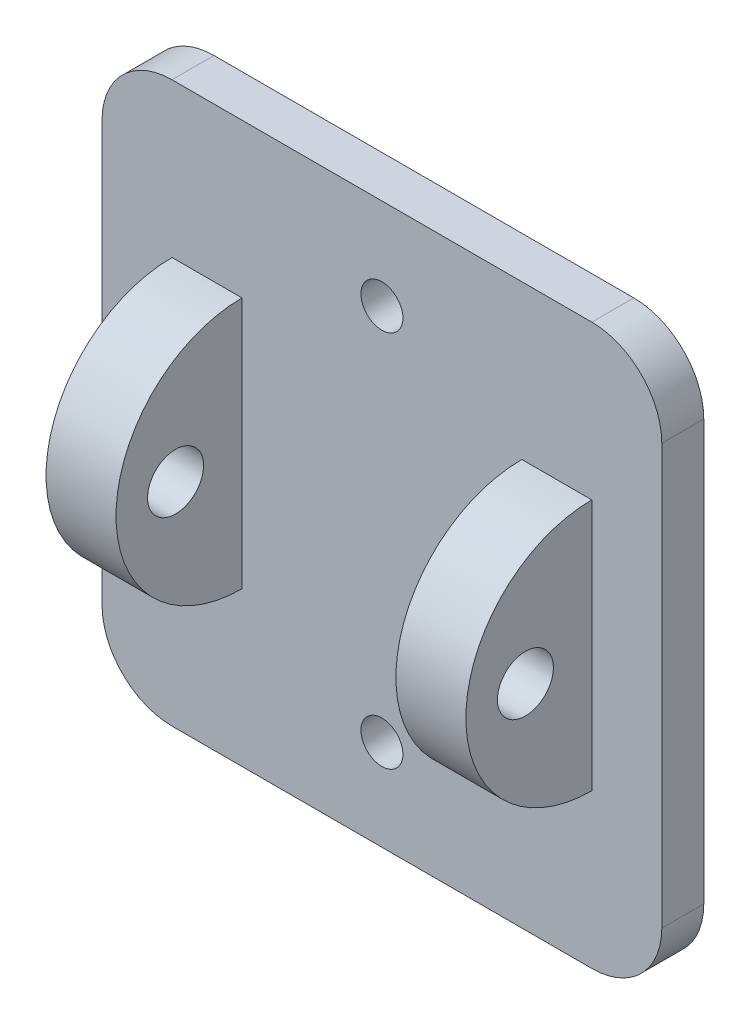
ISO-10303-21;
HEADER;
FILE_DESCRIPTION(('STEP AP214'),'2;1');
FILE_NAME('part.step','',(''),(''),'','','');
FILE_SCHEMA(('AUTOMOTIVE_DESIGN { 1 0 10303 214 1 1 1 1 }'));
ENDSEC;
DATA;
#1=APPLICATION_CONTEXT('core data for automotive mechanical design processes');
#2=APPLICATION_PROTOCOL_DEFINITION('international standard','automotive_design',2000,#1);
#3=PRODUCT_CONTEXT('',#1,'mechanical');
#4=PRODUCT('Part','Part','',(#3));
#5=PRODUCT_RELATED_PRODUCT_CATEGORY('part','',(#4));
#6=PRODUCT_DEFINITION_FORMATION('','',#4);
#7=PRODUCT_DEFINITION_CONTEXT('part definition',#1,'design');
#8=PRODUCT_DEFINITION('design','',#6,#7);
#9=PRODUCT_DEFINITION_SHAPE('','',#8);
#10=(LENGTH_UNIT() NAMED_UNIT(*) SI_UNIT(.MILLI.,.METRE.));
#11=(NAMED_UNIT(*) PLANE_ANGLE_UNIT() SI_UNIT($,.RADIAN.));
#12=(NAMED_UNIT(*) SI_UNIT($,.STERADIAN.) SOLID_ANGLE_UNIT());
#13=UNCERTAINTY_MEASURE_WITH_UNIT(LENGTH_MEASURE(1.E-05),#10,'distance_accuracy_value','');
#14=(GEOMETRIC_REPRESENTATION_CONTEXT(3) GLOBAL_UNCERTAINTY_ASSIGNED_CONTEXT((#13)) GLOBAL_UNIT_ASSIGNED_CONTEXT((#10,
#11,#12)) REPRESENTATION_CONTEXT('',''));
#15=CARTESIAN_POINT('',(0.,0.,0.));
#16=DIRECTION('',(0.,0.,1.));
#17=DIRECTION('',(1.,0.,0.));
#18=AXIS2_PLACEMENT_3D('',#15,#16,#17);
#19=CARTESIAN_POINT('',(22.3123663302852,-6.20192307692307,3.));
#20=DIRECTION('',(-1.,0.,0.));
#21=DIRECTION('',(0.,-1.,0.));
#22=AXIS2_PLACEMENT_3D('',#19,#20,#21);
#23=CYLINDRICAL_SURFACE('',#22,9.);
#24=DIRECTION('',(-1.,0.,0.));
#25=VECTOR('',#24,1.);
#26=CARTESIAN_POINT('',(-7.68763366971484,-15.2019230769231,3.));
#27=LINE('',#26,#25);
#28=CARTESIAN_POINT('',(22.3123663302852,-15.2019230769231,3.));
#29=VERTEX_POINT('',#28);
#30=CARTESIAN_POINT('',(17.3123663302852,-15.2019230769231,3.));
#31=VERTEX_POINT('',#30);
#32=EDGE_CURVE('E136',#29,#31,#27,.T.);
#33=ORIENTED_EDGE('',*,*,#32,.F.);
#34=CARTESIAN_POINT('',(22.3123663302852,-6.20192307692307,3.));
#35=DIRECTION('',(1.,0.,0.));
#36=DIRECTION('',(0.,0.,-1.));
#37=AXIS2_PLACEMENT_3D('',#34,#35,#36);
#38=CIRCLE('',#37,9.);
#39=CARTESIAN_POINT('',(22.3123663302852,2.79807692307693,3.));
#40=VERTEX_POINT('',#39);
#41=EDGE_CURVE('E50',#40,#29,#38,.T.);
#42=ORIENTED_EDGE('',*,*,#41,.F.);
#43=DIRECTION('',(1.,0.,0.));
#44=VECTOR('',#43,1.);
#45=CARTESIAN_POINT('',(-7.68763366971484,2.79807692307693,3.));
#46=LINE('',#45,#44);
#47=CARTESIAN_POINT('',(17.3123663302852,2.79807692307693,3.));
#48=VERTEX_POINT('',#47);
#49=EDGE_CURVE('E135',#48,#40,#46,.T.);
#50=ORIENTED_EDGE('',*,*,#49,.F.);
#51=CARTESIAN_POINT('',(17.3123663302852,-6.20192307692307,3.));
#52=DIRECTION('',(-1.,0.,0.));
#53=DIRECTION('',(0.,0.,1.));
#54=AXIS2_PLACEMENT_3D('',#51,#52,#53);
#55=CIRCLE('',#54,9.);
#56=EDGE_CURVE('E11',#31,#48,#55,.T.);
#57=ORIENTED_EDGE('',*,*,#56,.F.);
#58=EDGE_LOOP('',(#33,#42,#50,#57));
#59=FACE_BOUND('',#58,.T.);
#60=ADVANCED_FACE('F41',(#59),#23,.T.);
#61=CARTESIAN_POINT('',(-2.68763366971484,-6.20192307692307,3.));
#62=DIRECTION('',(-1.,0.,0.));
#63=DIRECTION('',(0.,0.,1.));
#64=AXIS2_PLACEMENT_3D('',#61,#62,#63);
#65=CYLINDRICAL_SURFACE('',#64,9.);
#66=DIRECTION('',(-1.,0.,0.));
#67=VECTOR('',#66,1.);
#68=CARTESIAN_POINT('',(-7.68763366971484,-15.2019230769231,3.));
#69=LINE('',#68,#67);
#70=CARTESIAN_POINT('',(-2.68763366971484,-15.2019230769231,3.));
#71=VERTEX_POINT('',#70);
#72=CARTESIAN_POINT('',(-7.68763366971484,-15.2019230769231,3.));
#73=VERTEX_POINT('',#72);
#74=EDGE_CURVE('E153',#71,#73,#69,.T.);
#75=ORIENTED_EDGE('',*,*,#74,.F.);
#76=CARTESIAN_POINT('',(-2.68763366971484,-6.20192307692307,3.));
#77=DIRECTION('',(1.,0.,0.));
#78=DIRECTION('',(0.,1.,0.));
#79=AXIS2_PLACEMENT_3D('',#76,#77,#78);
#80=CIRCLE('',#79,9.);
#81=CARTESIAN_POINT('',(-2.68763366971484,2.79807692307693,3.));
#82=VERTEX_POINT('',#81);
#83=EDGE_CURVE('E263',#82,#71,#80,.T.);
#84=ORIENTED_EDGE('',*,*,#83,.F.);
#85=DIRECTION('',(1.,0.,0.));
#86=VECTOR('',#85,1.);
#87=CARTESIAN_POINT('',(-7.68763366971484,2.79807692307693,3.));
#88=LINE('',#87,#86);
#89=CARTESIAN_POINT('',(-7.68763366971484,2.79807692307693,3.));
#90=VERTEX_POINT('',#89);
#91=EDGE_CURVE('E161',#90,#82,#88,.T.);
#92=ORIENTED_EDGE('',*,*,#91,.F.);
#93=CARTESIAN_POINT('',(-7.68763366971484,-6.20192307692307,3.));
#94=DIRECTION('',(-1.,0.,0.));
#95=DIRECTION('',(0.,-1.,0.));
#96=AXIS2_PLACEMENT_3D('',#93,#94,#95);
#97=CIRCLE('',#96,9.);
#98=EDGE_CURVE('E266',#73,#90,#97,.T.);
#99=ORIENTED_EDGE('',*,*,#98,.F.);
#100=EDGE_LOOP('',(#75,#84,#92,#99));
#101=FACE_BOUND('',#100,.T.);
#102=ADVANCED_FACE('F275',(#101),#65,.T.);
#103=CARTESIAN_POINT('',(-7.68763366971484,-21.2019230769231,3.));
#104=DIRECTION('',(0.,0.,1.));
#105=DIRECTION('',(1.,0.,0.));
#106=AXIS2_PLACEMENT_3D('',#103,#104,#105);
#107=PLANE('',#106);
#108=DIRECTION('',(0.,1.,0.));
#109=VECTOR('',#108,1.);
#110=CARTESIAN_POINT('',(17.3123663302852,-21.2019230769231,3.));
#111=LINE('',#110,#109);
#112=EDGE_CURVE('E130',#31,#48,#111,.T.);
#113=ORIENTED_EDGE('',*,*,#112,.T.);
#114=ORIENTED_EDGE('',*,*,#49,.T.);
#115=DIRECTION('',(0.,-1.,0.));
#116=VECTOR('',#115,1.);
#117=CARTESIAN_POINT('',(22.3123663302852,-21.2019230769231,3.));
#118=LINE('',#117,#116);
#119=EDGE_CURVE('E141',#40,#29,#118,.T.);
#120=ORIENTED_EDGE('',*,*,#119,.T.);
#121=ORIENTED_EDGE('',*,*,#32,.T.);
#122=EDGE_LOOP('',(#113,#114,#120,#121));
#123=FACE_BOUND('',#122,.T.);
#124=CARTESIAN_POINT('',(7.31236633028516,7.29807692307693,3.));
#125=DIRECTION('',(0.,0.,1.));
#126=DIRECTION('',(1.,0.,0.));
#127=AXIS2_PLACEMENT_3D('',#124,#125,#126);
#128=CIRCLE('',#127,1.5);
#129=CARTESIAN_POINT('',(8.81236633028516,7.29807692307693,3.));
#130=VERTEX_POINT('',#129);
#131=EDGE_CURVE('E174',#130,#130,#128,.T.);
#132=ORIENTED_EDGE('',*,*,#131,.F.);
#133=EDGE_LOOP('',(#132));
#134=FACE_BOUND('',#133,.T.);
#135=CARTESIAN_POINT('',(-7.68763366971484,-21.2019230769231,3.));
#136=DIRECTION('',(0.,0.,1.));
#137=DIRECTION('',(1.,0.,0.));
#138=AXIS2_PLACEMENT_3D('',#135,#136,#137);
#139=CIRCLE('',#138,5.);
#140=CARTESIAN_POINT('',(-12.6876336697148,-21.2019230769231,3.));
#141=VERTEX_POINT('',#140);
#142=CARTESIAN_POINT('',(-7.68763366971484,-26.2019230769231,3.));
#143=VERTEX_POINT('',#142);
#144=EDGE_CURVE('E182',#141,#143,#139,.T.);
#145=ORIENTED_EDGE('',*,*,#144,.T.);
#146=DIRECTION('',(1.,0.,0.));
#147=VECTOR('',#146,1.);
#148=CARTESIAN_POINT('',(-7.68763366971484,-26.2019230769231,3.));
#149=LINE('',#148,#147);
#150=CARTESIAN_POINT('',(22.3123663302852,-26.2019230769231,3.));
#151=VERTEX_POINT('',#150);
#152=EDGE_CURVE('E186',#143,#151,#149,.T.);
#153=ORIENTED_EDGE('',*,*,#152,.T.);
#154=CARTESIAN_POINT('',(22.3123663302852,-21.2019230769231,3.));
#155=DIRECTION('',(0.,0.,1.));
#156=DIRECTION('',(1.,0.,0.));
#157=AXIS2_PLACEMENT_3D('',#154,#155,#156);
#158=CIRCLE('',#157,5.);
#159=CARTESIAN_POINT('',(27.3123663302852,-21.2019230769231,3.));
#160=VERTEX_POINT('',#159);
#161=EDGE_CURVE('E190',#151,#160,#158,.T.);
#162=ORIENTED_EDGE('',*,*,#161,.T.);
#163=DIRECTION('',(0.,1.,0.));
#164=VECTOR('',#163,1.);
#165=CARTESIAN_POINT('',(27.3123663302852,8.79807692307693,3.));
#166=LINE('',#165,#164);
#167=CARTESIAN_POINT('',(27.3123663302852,8.79807692307694,3.));
#168=VERTEX_POINT('',#167);
#169=EDGE_CURVE('E193',#160,#168,#166,.T.);
#170=ORIENTED_EDGE('',*,*,#169,.T.);
#171=CARTESIAN_POINT('',(22.3123663302852,8.79807692307693,3.));
#172=DIRECTION('',(0.,0.,1.));
#173=DIRECTION('',(-1.,0.,0.));
#174=AXIS2_PLACEMENT_3D('',#171,#172,#173);
#175=CIRCLE('',#174,5.);
#176=CARTESIAN_POINT('',(22.3123663302852,13.7980769230769,3.));
#177=VERTEX_POINT('',#176);
#178=EDGE_CURVE('E196',#168,#177,#175,.T.);
#179=ORIENTED_EDGE('',*,*,#178,.T.);
#180=DIRECTION('',(-1.,0.,0.));
#181=VECTOR('',#180,1.);
#182=CARTESIAN_POINT('',(-7.68763366971484,13.7980769230769,3.));
#183=LINE('',#182,#181);
#184=CARTESIAN_POINT('',(-7.68763366971484,13.7980769230769,3.));
#185=VERTEX_POINT('',#184);
#186=EDGE_CURVE('E199',#177,#185,#183,.T.);
#187=ORIENTED_EDGE('',*,*,#186,.T.);
#188=CARTESIAN_POINT('',(-7.68763366971484,8.79807692307693,3.));
#189=DIRECTION('',(0.,0.,1.));
#190=DIRECTION('',(1.,0.,0.));
#191=AXIS2_PLACEMENT_3D('',#188,#189,#190);
#192=CIRCLE('',#191,5.);
#193=CARTESIAN_POINT('',(-12.6876336697148,8.79807692307693,3.));
#194=VERTEX_POINT('',#193);
#195=EDGE_CURVE('E202',#185,#194,#192,.T.);
#196=ORIENTED_EDGE('',*,*,#195,.T.);
#197=DIRECTION('',(0.,-1.,0.));
#198=VECTOR('',#197,1.);
#199=CARTESIAN_POINT('',(-12.6876336697148,8.79807692307693,3.));
#200=LINE('',#199,#198);
#201=EDGE_CURVE('E205',#194,#141,#200,.T.);
#202=ORIENTED_EDGE('',*,*,#201,.T.);
#203=EDGE_LOOP('',(#145,#153,#162,#170,#179,#187,#196,#202));
#204=FACE_BOUND('',#203,.T.);
#205=CARTESIAN_POINT('',(7.31236633028516,-19.7019230769231,3.));
#206=DIRECTION('',(0.,0.,1.));
#207=DIRECTION('',(1.,0.,0.));
#208=AXIS2_PLACEMENT_3D('',#205,#206,#207);
#209=CIRCLE('',#208,1.5);
#210=CARTESIAN_POINT('',(8.81236633028517,-19.7019230769231,3.));
#211=VERTEX_POINT('',#210);
#212=EDGE_CURVE('E166',#211,#211,#209,.T.);
#213=ORIENTED_EDGE('',*,*,#212,.F.);
#214=EDGE_LOOP('',(#213));
#215=FACE_BOUND('',#214,.T.);
#216=ORIENTED_EDGE('',*,*,#91,.T.);
#217=DIRECTION('',(0.,-1.,0.));
#218=VECTOR('',#217,1.);
#219=CARTESIAN_POINT('',(-2.68763366971484,-21.2019230769231,3.));
#220=LINE('',#219,#218);
#221=EDGE_CURVE('E149',#82,#71,#220,.T.);
#222=ORIENTED_EDGE('',*,*,#221,.T.);
#223=ORIENTED_EDGE('',*,*,#74,.T.);
#224=DIRECTION('',(0.,1.,0.));
#225=VECTOR('',#224,1.);
#226=CARTESIAN_POINT('',(-7.68763366971484,-21.2019230769231,3.));
#227=LINE('',#226,#225);
#228=EDGE_CURVE('E157',#73,#90,#227,.T.);
#229=ORIENTED_EDGE('',*,*,#228,.T.);
#230=EDGE_LOOP('',(#216,#222,#223,#229));
#231=FACE_BOUND('',#230,.T.);
#232=ADVANCED_FACE('F133',(#123,#134,#204,#215,#231),#107,.T.);
#233=CARTESIAN_POINT('',(-7.68763366971484,-21.2019230769231,0.));
#234=DIRECTION('',(0.,0.,1.));
#235=DIRECTION('',(1.,0.,0.));
#236=AXIS2_PLACEMENT_3D('',#233,#234,#235);
#237=PLANE('',#236);
#238=CARTESIAN_POINT('',(-7.68763366971484,-21.2019230769231,0.));
#239=DIRECTION('',(0.,0.,1.));
#240=DIRECTION('',(1.,0.,0.));
#241=AXIS2_PLACEMENT_3D('',#238,#239,#240);
#242=CIRCLE('',#241,5.);
#243=CARTESIAN_POINT('',(-12.6876336697148,-21.2019230769231,0.));
#244=VERTEX_POINT('',#243);
#245=CARTESIAN_POINT('',(-7.68763366971484,-26.2019230769231,0.));
#246=VERTEX_POINT('',#245);
#247=EDGE_CURVE('E178',#244,#246,#242,.T.);
#248=ORIENTED_EDGE('',*,*,#247,.F.);
#249=DIRECTION('',(0.,-1.,0.));
#250=VECTOR('',#249,1.);
#251=CARTESIAN_POINT('',(-12.6876336697148,8.79807692307693,0.));
#252=LINE('',#251,#250);
#253=CARTESIAN_POINT('',(-12.6876336697148,8.79807692307693,0.));
#254=VERTEX_POINT('',#253);
#255=EDGE_CURVE('E187',#254,#244,#252,.T.);
#256=ORIENTED_EDGE('',*,*,#255,.F.);
#257=CARTESIAN_POINT('',(-7.68763366971484,8.79807692307693,0.));
#258=DIRECTION('',(0.,0.,1.));
#259=DIRECTION('',(1.,0.,0.));
#260=AXIS2_PLACEMENT_3D('',#257,#258,#259);
#261=CIRCLE('',#260,5.);
#262=CARTESIAN_POINT('',(-7.68763366971484,13.7980769230769,0.));
#263=VERTEX_POINT('',#262);
#264=EDGE_CURVE('E227',#263,#254,#261,.T.);
#265=ORIENTED_EDGE('',*,*,#264,.F.);
#266=DIRECTION('',(-1.,0.,0.));
#267=VECTOR('',#266,1.);
#268=CARTESIAN_POINT('',(-7.68763366971484,13.7980769230769,0.));
#269=LINE('',#268,#267);
#270=CARTESIAN_POINT('',(22.3123663302852,13.7980769230769,0.));
#271=VERTEX_POINT('',#270);
#272=EDGE_CURVE('E224',#271,#263,#269,.T.);
#273=ORIENTED_EDGE('',*,*,#272,.F.);
#274=CARTESIAN_POINT('',(22.3123663302852,8.79807692307693,0.));
#275=DIRECTION('',(0.,0.,1.));
#276=DIRECTION('',(-1.,0.,0.));
#277=AXIS2_PLACEMENT_3D('',#274,#275,#276);
#278=CIRCLE('',#277,5.);
#279=CARTESIAN_POINT('',(27.3123663302852,8.79807692307694,0.));
#280=VERTEX_POINT('',#279);
#281=EDGE_CURVE('E221',#280,#271,#278,.T.);
#282=ORIENTED_EDGE('',*,*,#281,.F.);
#283=DIRECTION('',(0.,1.,0.));
#284=VECTOR('',#283,1.);
#285=CARTESIAN_POINT('',(27.3123663302852,8.79807692307693,0.));
#286=LINE('',#285,#284);
#287=CARTESIAN_POINT('',(27.3123663302852,-21.2019230769231,0.));
#288=VERTEX_POINT('',#287);
#289=EDGE_CURVE('E218',#288,#280,#286,.T.);
#290=ORIENTED_EDGE('',*,*,#289,.F.);
#291=CARTESIAN_POINT('',(22.3123663302852,-21.2019230769231,0.));
#292=DIRECTION('',(0.,0.,1.));
#293=DIRECTION('',(1.,0.,0.));
#294=AXIS2_PLACEMENT_3D('',#291,#292,#293);
#295=CIRCLE('',#294,5.);
#296=CARTESIAN_POINT('',(22.3123663302852,-26.2019230769231,0.));
#297=VERTEX_POINT('',#296);
#298=EDGE_CURVE('E215',#297,#288,#295,.T.);
#299=ORIENTED_EDGE('',*,*,#298,.F.);
#300=DIRECTION('',(1.,0.,0.));
#301=VECTOR('',#300,1.);
#302=CARTESIAN_POINT('',(-7.68763366971484,-26.2019230769231,0.));
#303=LINE('',#302,#301);
#304=EDGE_CURVE('E212',#246,#297,#303,.T.);
#305=ORIENTED_EDGE('',*,*,#304,.F.);
#306=EDGE_LOOP('',(#248,#256,#265,#273,#282,#290,#299,#305));
#307=FACE_BOUND('',#306,.T.);
#308=CARTESIAN_POINT('',(7.31236633028516,7.29807692307693,0.));
#309=DIRECTION('',(0.,0.,1.));
#310=DIRECTION('',(1.,0.,0.));
#311=AXIS2_PLACEMENT_3D('',#308,#309,#310);
#312=CIRCLE('',#311,1.5);
#313=CARTESIAN_POINT('',(8.81236633028516,7.29807692307693,0.));
#314=VERTEX_POINT('',#313);
#315=EDGE_CURVE('E170',#314,#314,#312,.T.);
#316=ORIENTED_EDGE('',*,*,#315,.T.);
#317=EDGE_LOOP('',(#316));
#318=FACE_BOUND('',#317,.T.);
#319=CARTESIAN_POINT('',(7.31236633028516,-19.7019230769231,0.));
#320=DIRECTION('',(0.,0.,1.));
#321=DIRECTION('',(1.,0.,0.));
#322=AXIS2_PLACEMENT_3D('',#319,#320,#321);
#323=CIRCLE('',#322,1.5);
#324=CARTESIAN_POINT('',(8.81236633028517,-19.7019230769231,0.));
#325=VERTEX_POINT('',#324);
#326=EDGE_CURVE('E165',#325,#325,#323,.T.);
#327=ORIENTED_EDGE('',*,*,#326,.T.);
#328=EDGE_LOOP('',(#327));
#329=FACE_BOUND('',#328,.T.);
#330=ADVANCED_FACE('F301',(#307,#318,#329),#237,.F.);
#331=CARTESIAN_POINT('',(-7.68763366971484,-21.2019230769231,3.));
#332=DIRECTION('',(0.,0.,-1.));
#333=DIRECTION('',(-1.,0.,0.));
#334=AXIS2_PLACEMENT_3D('',#331,#332,#333);
#335=CYLINDRICAL_SURFACE('',#334,5.);
#336=ORIENTED_EDGE('',*,*,#247,.T.);
#337=DIRECTION('',(0.,0.,-1.));
#338=VECTOR('',#337,1.);
#339=CARTESIAN_POINT('',(-7.68763366971484,-26.2019230769231,3.));
#340=LINE('',#339,#338);
#341=EDGE_CURVE('E259',#143,#246,#340,.T.);
#342=ORIENTED_EDGE('',*,*,#341,.F.);
#343=ORIENTED_EDGE('',*,*,#144,.F.);
#344=DIRECTION('',(0.,0.,-1.));
#345=VECTOR('',#344,1.);
#346=CARTESIAN_POINT('',(-12.6876336697148,-21.2019230769231,3.));
#347=LINE('',#346,#345);
#348=EDGE_CURVE('E208',#141,#244,#347,.T.);
#349=ORIENTED_EDGE('',*,*,#348,.T.);
#350=EDGE_LOOP('',(#336,#342,#343,#349));
#351=FACE_BOUND('',#350,.T.);
#352=ADVANCED_FACE('F307',(#351),#335,.T.);
#353=CARTESIAN_POINT('',(-7.68763366971484,-26.2019230769231,3.));
#354=DIRECTION('',(0.,1.,0.));
#355=DIRECTION('',(-1.,0.,0.));
#356=AXIS2_PLACEMENT_3D('',#353,#354,#355);
#357=PLANE('',#356);
#358=ORIENTED_EDGE('',*,*,#304,.T.);
#359=DIRECTION('',(0.,0.,-1.));
#360=VECTOR('',#359,1.);
#361=CARTESIAN_POINT('',(22.3123663302852,-26.2019230769231,3.));
#362=LINE('',#361,#360);
#363=EDGE_CURVE('E255',#151,#297,#362,.T.);
#364=ORIENTED_EDGE('',*,*,#363,.F.);
#365=ORIENTED_EDGE('',*,*,#152,.F.);
#366=ORIENTED_EDGE('',*,*,#341,.T.);
#367=EDGE_LOOP('',(#358,#364,#365,#366));
#368=FACE_BOUND('',#367,.T.);
#369=ADVANCED_FACE('F310',(#368),#357,.F.);
#370=CARTESIAN_POINT('',(22.3123663302852,-21.2019230769231,3.));
#371=DIRECTION('',(0.,0.,-1.));
#372=DIRECTION('',(-1.,0.,0.));
#373=AXIS2_PLACEMENT_3D('',#370,#371,#372);
#374=CYLINDRICAL_SURFACE('',#373,5.);
#375=ORIENTED_EDGE('',*,*,#298,.T.);
#376=DIRECTION('',(0.,0.,-1.));
#377=VECTOR('',#376,1.);
#378=CARTESIAN_POINT('',(27.3123663302852,-21.2019230769231,3.));
#379=LINE('',#378,#377);
#380=EDGE_CURVE('E251',#160,#288,#379,.T.);
#381=ORIENTED_EDGE('',*,*,#380,.F.);
#382=ORIENTED_EDGE('',*,*,#161,.F.);
#383=ORIENTED_EDGE('',*,*,#363,.T.);
#384=EDGE_LOOP('',(#375,#381,#382,#383));
#385=FACE_BOUND('',#384,.T.);
#386=ADVANCED_FACE('F314',(#385),#374,.T.);
#387=CARTESIAN_POINT('',(27.3123663302852,8.79807692307693,3.));
#388=DIRECTION('',(-1.,0.,0.));
#389=DIRECTION('',(0.,0.,1.));
#390=AXIS2_PLACEMENT_3D('',#387,#388,#389);
#391=PLANE('',#390);
#392=ORIENTED_EDGE('',*,*,#289,.T.);
#393=DIRECTION('',(0.,0.,-1.));
#394=VECTOR('',#393,1.);
#395=CARTESIAN_POINT('',(27.3123663302852,8.79807692307694,3.));
#396=LINE('',#395,#394);
#397=EDGE_CURVE('E247',#168,#280,#396,.T.);
#398=ORIENTED_EDGE('',*,*,#397,.F.);
#399=ORIENTED_EDGE('',*,*,#169,.F.);
#400=ORIENTED_EDGE('',*,*,#380,.T.);
#401=EDGE_LOOP('',(#392,#398,#399,#400));
#402=FACE_BOUND('',#401,.T.);
#403=ADVANCED_FACE('F318',(#402),#391,.F.);
#404=CARTESIAN_POINT('',(22.3123663302852,8.79807692307693,3.));
#405=DIRECTION('',(0.,0.,-1.));
#406=DIRECTION('',(-1.,0.,0.));
#407=AXIS2_PLACEMENT_3D('',#404,#405,#406);
#408=CYLINDRICAL_SURFACE('',#407,5.);
#409=ORIENTED_EDGE('',*,*,#281,.T.);
#410=DIRECTION('',(0.,0.,-1.));
#411=VECTOR('',#410,1.);
#412=CARTESIAN_POINT('',(22.3123663302852,13.7980769230769,3.));
#413=LINE('',#412,#411);
#414=EDGE_CURVE('E243',#177,#271,#413,.T.);
#415=ORIENTED_EDGE('',*,*,#414,.F.);
#416=ORIENTED_EDGE('',*,*,#178,.F.);
#417=ORIENTED_EDGE('',*,*,#397,.T.);
#418=EDGE_LOOP('',(#409,#415,#416,#417));
#419=FACE_BOUND('',#418,.T.);
#420=ADVANCED_FACE('F322',(#419),#408,.T.);
#421=CARTESIAN_POINT('',(-7.68763366971484,13.7980769230769,3.));
#422=DIRECTION('',(0.,-1.,0.));
#423=DIRECTION('',(1.,0.,0.));
#424=AXIS2_PLACEMENT_3D('',#421,#422,#423);
#425=PLANE('',#424);
#426=ORIENTED_EDGE('',*,*,#272,.T.);
#427=DIRECTION('',(0.,0.,-1.));
#428=VECTOR('',#427,1.);
#429=CARTESIAN_POINT('',(-7.68763366971484,13.7980769230769,3.));
#430=LINE('',#429,#428);
#431=EDGE_CURVE('E239',#185,#263,#430,.T.);
#432=ORIENTED_EDGE('',*,*,#431,.F.);
#433=ORIENTED_EDGE('',*,*,#186,.F.);
#434=ORIENTED_EDGE('',*,*,#414,.T.);
#435=EDGE_LOOP('',(#426,#432,#433,#434));
#436=FACE_BOUND('',#435,.T.);
#437=ADVANCED_FACE('F326',(#436),#425,.F.);
#438=CARTESIAN_POINT('',(-7.68763366971484,8.79807692307693,3.));
#439=DIRECTION('',(0.,0.,-1.));
#440=DIRECTION('',(-1.,0.,0.));
#441=AXIS2_PLACEMENT_3D('',#438,#439,#440);
#442=CYLINDRICAL_SURFACE('',#441,5.);
#443=ORIENTED_EDGE('',*,*,#264,.T.);
#444=DIRECTION('',(0.,0.,-1.));
#445=VECTOR('',#444,1.);
#446=CARTESIAN_POINT('',(-12.6876336697148,8.79807692307693,3.));
#447=LINE('',#446,#445);
#448=EDGE_CURVE('E235',#194,#254,#447,.T.);
#449=ORIENTED_EDGE('',*,*,#448,.F.);
#450=ORIENTED_EDGE('',*,*,#195,.F.);
#451=ORIENTED_EDGE('',*,*,#431,.T.);
#452=EDGE_LOOP('',(#443,#449,#450,#451));
#453=FACE_BOUND('',#452,.T.);
#454=ADVANCED_FACE('F330',(#453),#442,.T.);
#455=CARTESIAN_POINT('',(-12.6876336697148,8.79807692307693,3.));
#456=DIRECTION('',(1.,0.,0.));
#457=DIRECTION('',(0.,1.,0.));
#458=AXIS2_PLACEMENT_3D('',#455,#456,#457);
#459=PLANE('',#458);
#460=ORIENTED_EDGE('',*,*,#255,.T.);
#461=ORIENTED_EDGE('',*,*,#348,.F.);
#462=ORIENTED_EDGE('',*,*,#201,.F.);
#463=ORIENTED_EDGE('',*,*,#448,.T.);
#464=EDGE_LOOP('',(#460,#461,#462,#463));
#465=FACE_BOUND('',#464,.T.);
#466=ADVANCED_FACE('F334',(#465),#459,.F.);
#467=CARTESIAN_POINT('',(7.31236633028516,7.29807692307693,3.));
#468=DIRECTION('',(0.,0.,-1.));
#469=DIRECTION('',(-1.,0.,0.));
#470=AXIS2_PLACEMENT_3D('',#467,#468,#469);
#471=CYLINDRICAL_SURFACE('',#470,1.5);
#472=ORIENTED_EDGE('',*,*,#131,.T.);
#473=EDGE_LOOP('',(#472));
#474=FACE_BOUND('',#473,.T.);
#475=ORIENTED_EDGE('',*,*,#315,.F.);
#476=EDGE_LOOP('',(#475));
#477=FACE_BOUND('',#476,.T.);
#478=ADVANCED_FACE('F290',(#474,#477),#471,.F.);
#479=CARTESIAN_POINT('',(7.31236633028516,-19.7019230769231,3.));
#480=DIRECTION('',(0.,0.,-1.));
#481=DIRECTION('',(-1.,0.,0.));
#482=AXIS2_PLACEMENT_3D('',#479,#480,#481);
#483=CYLINDRICAL_SURFACE('',#482,1.5);
#484=ORIENTED_EDGE('',*,*,#212,.T.);
#485=EDGE_LOOP('',(#484));
#486=FACE_BOUND('',#485,.T.);
#487=ORIENTED_EDGE('',*,*,#326,.F.);
#488=EDGE_LOOP('',(#487));
#489=FACE_BOUND('',#488,.T.);
#490=ADVANCED_FACE('F281',(#486,#489),#483,.F.);
#491=CARTESIAN_POINT('',(-2.68763366971484,-21.2019230769231,12.));
#492=DIRECTION('',(1.,0.,0.));
#493=DIRECTION('',(0.,1.,0.));
#494=AXIS2_PLACEMENT_3D('',#491,#492,#493);
#495=PLANE('',#494);
#496=CARTESIAN_POINT('',(-2.68763366971484,-6.20192307692307,7.74625312));
#497=DIRECTION('',(1.,0.,0.));
#498=DIRECTION('',(0.,1.,0.));
#499=AXIS2_PLACEMENT_3D('',#496,#497,#498);
#500=CIRCLE('',#499,2.);
#501=CARTESIAN_POINT('',(-2.68763366971484,-4.20192307692307,7.74625312));
#502=VERTEX_POINT('',#501);
#503=EDGE_CURVE('E138',#502,#502,#500,.T.);
#504=ORIENTED_EDGE('',*,*,#503,.F.);
#505=EDGE_LOOP('',(#504));
#506=FACE_BOUND('',#505,.T.);
#507=ORIENTED_EDGE('',*,*,#221,.F.);
#508=ORIENTED_EDGE('',*,*,#83,.T.);
#509=EDGE_LOOP('',(#507,#508));
#510=FACE_BOUND('',#509,.T.);
#511=ADVANCED_FACE('F279',(#506,#510),#495,.T.);
#512=CARTESIAN_POINT('',(-7.68763366971484,-21.2019230769231,12.));
#513=DIRECTION('',(-1.,0.,0.));
#514=DIRECTION('',(0.,-1.,0.));
#515=AXIS2_PLACEMENT_3D('',#512,#513,#514);
#516=PLANE('',#515);
#517=CARTESIAN_POINT('',(-7.68763366971484,-6.20192307692307,7.74625312));
#518=DIRECTION('',(-1.,0.,0.));
#519=DIRECTION('',(0.,-1.,0.));
#520=AXIS2_PLACEMENT_3D('',#517,#518,#519);
#521=CIRCLE('',#520,2.);
#522=CARTESIAN_POINT('',(-7.68763366971484,-8.20192307692307,7.74625312));
#523=VERTEX_POINT('',#522);
#524=EDGE_CURVE('E454',#523,#523,#521,.T.);
#525=ORIENTED_EDGE('',*,*,#524,.F.);
#526=EDGE_LOOP('',(#525));
#527=FACE_BOUND('',#526,.T.);
#528=ORIENTED_EDGE('',*,*,#228,.F.);
#529=ORIENTED_EDGE('',*,*,#98,.T.);
#530=EDGE_LOOP('',(#528,#529));
#531=FACE_BOUND('',#530,.T.);
#532=ADVANCED_FACE('F272',(#527,#531),#516,.T.);
#533=CARTESIAN_POINT('',(17.3123663302852,-21.2019230769231,12.));
#534=DIRECTION('',(-1.,0.,0.));
#535=DIRECTION('',(0.,0.,1.));
#536=AXIS2_PLACEMENT_3D('',#533,#534,#535);
#537=PLANE('',#536);
#538=CARTESIAN_POINT('',(17.3123663302852,-6.20192307692307,7.74625312));
#539=DIRECTION('',(-1.,0.,0.));
#540=DIRECTION('',(0.,0.,1.));
#541=AXIS2_PLACEMENT_3D('',#538,#539,#540);
#542=CIRCLE('',#541,2.);
#543=CARTESIAN_POINT('',(17.3123663302852,-6.20192307692307,9.74625312));
#544=VERTEX_POINT('',#543);
#545=EDGE_CURVE('E460',#544,#544,#542,.T.);
#546=ORIENTED_EDGE('',*,*,#545,.F.);
#547=EDGE_LOOP('',(#546));
#548=FACE_BOUND('',#547,.T.);
#549=ORIENTED_EDGE('',*,*,#112,.F.);
#550=ORIENTED_EDGE('',*,*,#56,.T.);
#551=EDGE_LOOP('',(#549,#550));
#552=FACE_BOUND('',#551,.T.);
#553=ADVANCED_FACE('F129',(#548,#552),#537,.T.);
#554=CARTESIAN_POINT('',(22.3123663302852,-21.2019230769231,12.));
#555=DIRECTION('',(1.,0.,0.));
#556=DIRECTION('',(0.,0.,-1.));
#557=AXIS2_PLACEMENT_3D('',#554,#555,#556);
#558=PLANE('',#557);
#559=CARTESIAN_POINT('',(22.3123663302852,-6.20192307692307,7.74625312));
#560=DIRECTION('',(1.,0.,0.));
#561=DIRECTION('',(0.,0.,-1.));
#562=AXIS2_PLACEMENT_3D('',#559,#560,#561);
#563=CIRCLE('',#562,2.);
#564=CARTESIAN_POINT('',(22.3123663302852,-6.20192307692307,5.74625312));
#565=VERTEX_POINT('',#564);
#566=EDGE_CURVE('E456',#565,#565,#563,.F.);
#567=ORIENTED_EDGE('',*,*,#566,.T.);
#568=EDGE_LOOP('',(#567));
#569=FACE_BOUND('',#568,.T.);
#570=ORIENTED_EDGE('',*,*,#119,.F.);
#571=ORIENTED_EDGE('',*,*,#41,.T.);
#572=EDGE_LOOP('',(#570,#571));
#573=FACE_BOUND('',#572,.T.);
#574=ADVANCED_FACE('F419',(#569,#573),#558,.T.);
#575=CARTESIAN_POINT('',(27.9692205797775,-6.20192307692306,7.74625312));
#576=DIRECTION('',(-1.,0.,0.));
#577=DIRECTION('',(0.,-1.,0.));
#578=AXIS2_PLACEMENT_3D('',#575,#576,#577);
#579=CYLINDRICAL_SURFACE('',#578,2.);
#580=ORIENTED_EDGE('',*,*,#545,.T.);
#581=EDGE_LOOP('',(#580));
#582=FACE_BOUND('',#581,.T.);
#583=ORIENTED_EDGE('',*,*,#566,.F.);
#584=EDGE_LOOP('',(#583));
#585=FACE_BOUND('',#584,.T.);
#586=ADVANCED_FACE('F428',(#582,#585),#579,.F.);
#587=ORIENTED_EDGE('',*,*,#503,.T.);
#588=EDGE_LOOP('',(#587));
#589=FACE_BOUND('',#588,.T.);
#590=ORIENTED_EDGE('',*,*,#524,.T.);
#591=EDGE_LOOP('',(#590));
#592=FACE_BOUND('',#591,.T.);
#593=ADVANCED_FACE('F437',(#589,#592),#579,.F.);
#594=CLOSED_SHELL('',(#60,#102,#232,#330,#352,#369,#386,#403,#420,#437,#454,#466,#478,#490,#511,
#532,#553,#574,#586,#593));
#595=MANIFOLD_SOLID_BREP('B2',#594);
#596=ADVANCED_BREP_SHAPE_REPRESENTATION('',(#18,#595),#14);
#597=SHAPE_DEFINITION_REPRESENTATION(#9,#596);
ENDSEC;
END-ISO-10303-21;
